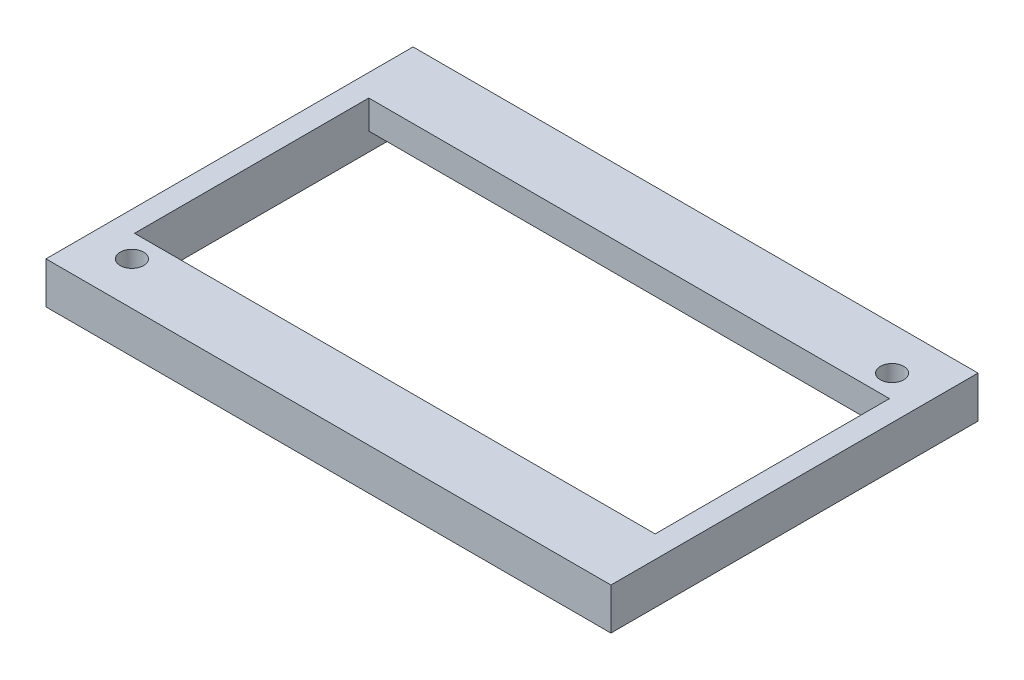
ISO-10303-21;
HEADER;
FILE_DESCRIPTION(('STEP AP214'),'2;1');
FILE_NAME('part.step','',(''),(''),'','','');
FILE_SCHEMA(('AUTOMOTIVE_DESIGN { 1 0 10303 214 1 1 1 1 }'));
ENDSEC;
DATA;
#1=APPLICATION_CONTEXT('core data for automotive mechanical design processes');
#2=APPLICATION_PROTOCOL_DEFINITION('international standard','automotive_design',2000,#1);
#3=PRODUCT_CONTEXT('',#1,'mechanical');
#4=PRODUCT('Part','Part','',(#3));
#5=PRODUCT_RELATED_PRODUCT_CATEGORY('part','',(#4));
#6=PRODUCT_DEFINITION_FORMATION('','',#4);
#7=PRODUCT_DEFINITION_CONTEXT('part definition',#1,'design');
#8=PRODUCT_DEFINITION('design','',#6,#7);
#9=PRODUCT_DEFINITION_SHAPE('','',#8);
#10=(LENGTH_UNIT() NAMED_UNIT(*) SI_UNIT(.MILLI.,.METRE.));
#11=(NAMED_UNIT(*) PLANE_ANGLE_UNIT() SI_UNIT($,.RADIAN.));
#12=(NAMED_UNIT(*) SI_UNIT($,.STERADIAN.) SOLID_ANGLE_UNIT());
#13=UNCERTAINTY_MEASURE_WITH_UNIT(LENGTH_MEASURE(1.E-05),#10,'distance_accuracy_value','');
#14=(GEOMETRIC_REPRESENTATION_CONTEXT(3) GLOBAL_UNCERTAINTY_ASSIGNED_CONTEXT((#13)) GLOBAL_UNIT_ASSIGNED_CONTEXT((#10,
#11,#12)) REPRESENTATION_CONTEXT('',''));
#15=CARTESIAN_POINT('',(0.,0.,0.));
#16=DIRECTION('',(0.,0.,1.));
#17=DIRECTION('',(1.,0.,0.));
#18=AXIS2_PLACEMENT_3D('',#15,#16,#17);
#19=CARTESIAN_POINT('',(50.,-1.,22.5));
#20=DIRECTION('',(0.,0.,-1.));
#21=DIRECTION('',(-1.,0.,0.));
#22=AXIS2_PLACEMENT_3D('',#19,#20,#21);
#23=PLANE('',#22);
#24=DIRECTION('',(0.,1.,0.));
#25=VECTOR('',#24,1.);
#26=CARTESIAN_POINT('',(50.,-1.,22.5));
#27=LINE('',#26,#25);
#28=CARTESIAN_POINT('',(50.,2.5,22.5));
#29=VERTEX_POINT('',#28);
#30=CARTESIAN_POINT('',(50.,8.,22.5));
#31=VERTEX_POINT('',#30);
#32=EDGE_CURVE('E200',#29,#31,#27,.T.);
#33=ORIENTED_EDGE('',*,*,#32,.F.);
#34=DIRECTION('',(-1.,0.,0.));
#35=VECTOR('',#34,1.);
#36=CARTESIAN_POINT('',(50.,2.5,22.5));
#37=LINE('',#36,#35);
#38=CARTESIAN_POINT('',(-50.,2.5,22.5));
#39=VERTEX_POINT('',#38);
#40=EDGE_CURVE('E193',#29,#39,#37,.T.);
#41=ORIENTED_EDGE('',*,*,#40,.T.);
#42=DIRECTION('',(0.,1.,0.));
#43=VECTOR('',#42,1.);
#44=CARTESIAN_POINT('',(-50.,-1.,22.5));
#45=LINE('',#44,#43);
#46=CARTESIAN_POINT('',(-50.,8.,22.5));
#47=VERTEX_POINT('',#46);
#48=EDGE_CURVE('E216',#39,#47,#45,.T.);
#49=ORIENTED_EDGE('',*,*,#48,.T.);
#50=DIRECTION('',(-1.,0.,0.));
#51=VECTOR('',#50,1.);
#52=CARTESIAN_POINT('',(50.,8.,22.5));
#53=LINE('',#52,#51);
#54=EDGE_CURVE('E195',#31,#47,#53,.T.);
#55=ORIENTED_EDGE('',*,*,#54,.F.);
#56=EDGE_LOOP('',(#33,#41,#49,#55));
#57=FACE_BOUND('',#56,.T.);
#58=ADVANCED_FACE('F37',(#57),#23,.T.);
#59=CARTESIAN_POINT('',(50.,-1.,-22.5));
#60=DIRECTION('',(0.,0.,-1.));
#61=DIRECTION('',(-1.,0.,0.));
#62=AXIS2_PLACEMENT_3D('',#59,#60,#61);
#63=PLANE('',#62);
#64=DIRECTION('',(-1.,0.,0.));
#65=VECTOR('',#64,1.);
#66=CARTESIAN_POINT('',(50.,2.5,-22.5));
#67=LINE('',#66,#65);
#68=CARTESIAN_POINT('',(50.,2.5,-22.5));
#69=VERTEX_POINT('',#68);
#70=CARTESIAN_POINT('',(-50.,2.5,-22.5));
#71=VERTEX_POINT('',#70);
#72=EDGE_CURVE('E157',#69,#71,#67,.T.);
#73=ORIENTED_EDGE('',*,*,#72,.F.);
#74=DIRECTION('',(0.,1.,0.));
#75=VECTOR('',#74,1.);
#76=CARTESIAN_POINT('',(50.,-1.,-22.5));
#77=LINE('',#76,#75);
#78=CARTESIAN_POINT('',(50.,8.,-22.5));
#79=VERTEX_POINT('',#78);
#80=EDGE_CURVE('E212',#69,#79,#77,.T.);
#81=ORIENTED_EDGE('',*,*,#80,.T.);
#82=DIRECTION('',(-1.,0.,0.));
#83=VECTOR('',#82,1.);
#84=CARTESIAN_POINT('',(50.,8.,-22.5));
#85=LINE('',#84,#83);
#86=CARTESIAN_POINT('',(-50.,8.,-22.5));
#87=VERTEX_POINT('',#86);
#88=EDGE_CURVE('E206',#79,#87,#85,.T.);
#89=ORIENTED_EDGE('',*,*,#88,.T.);
#90=DIRECTION('',(0.,1.,0.));
#91=VECTOR('',#90,1.);
#92=CARTESIAN_POINT('',(-50.,-1.,-22.5));
#93=LINE('',#92,#91);
#94=EDGE_CURVE('E214',#71,#87,#93,.T.);
#95=ORIENTED_EDGE('',*,*,#94,.F.);
#96=EDGE_LOOP('',(#73,#81,#89,#95));
#97=FACE_BOUND('',#96,.T.);
#98=ADVANCED_FACE('F295',(#97),#63,.F.);
#99=CARTESIAN_POINT('',(0.,8.,0.));
#100=DIRECTION('',(0.,1.,0.));
#101=DIRECTION('',(0.,0.,1.));
#102=AXIS2_PLACEMENT_3D('',#99,#100,#101);
#103=PLANE('',#102);
#104=CARTESIAN_POINT('',(46.,8.,-27.));
#105=DIRECTION('',(0.,1.,0.));
#106=DIRECTION('',(0.,0.,1.));
#107=AXIS2_PLACEMENT_3D('',#104,#105,#106);
#108=CIRCLE('',#107,2.25);
#109=CARTESIAN_POINT('',(46.,8.,-24.75));
#110=VERTEX_POINT('',#109);
#111=EDGE_CURVE('E284',#110,#110,#108,.T.);
#112=ORIENTED_EDGE('',*,*,#111,.F.);
#113=EDGE_LOOP('',(#112));
#114=FACE_BOUND('',#113,.T.);
#115=CARTESIAN_POINT('',(-46.,8.,27.));
#116=DIRECTION('',(0.,1.,0.));
#117=DIRECTION('',(0.,0.,1.));
#118=AXIS2_PLACEMENT_3D('',#115,#116,#117);
#119=CIRCLE('',#118,2.25);
#120=CARTESIAN_POINT('',(-46.,8.,29.25));
#121=VERTEX_POINT('',#120);
#122=EDGE_CURVE('E277',#121,#121,#119,.T.);
#123=ORIENTED_EDGE('',*,*,#122,.F.);
#124=EDGE_LOOP('',(#123));
#125=FACE_BOUND('',#124,.T.);
#126=DIRECTION('',(0.,0.,1.));
#127=VECTOR('',#126,1.);
#128=CARTESIAN_POINT('',(-54.25,8.,35.25));
#129=LINE('',#128,#127);
#130=CARTESIAN_POINT('',(-54.25,8.,-35.25));
#131=VERTEX_POINT('',#130);
#132=CARTESIAN_POINT('',(-54.25,8.,35.25));
#133=VERTEX_POINT('',#132);
#134=EDGE_CURVE('E252',#131,#133,#129,.T.);
#135=ORIENTED_EDGE('',*,*,#134,.T.);
#136=DIRECTION('',(1.,0.,0.));
#137=VECTOR('',#136,1.);
#138=CARTESIAN_POINT('',(54.25,8.,35.25));
#139=LINE('',#138,#137);
#140=CARTESIAN_POINT('',(54.25,8.,35.25));
#141=VERTEX_POINT('',#140);
#142=EDGE_CURVE('E255',#133,#141,#139,.T.);
#143=ORIENTED_EDGE('',*,*,#142,.T.);
#144=DIRECTION('',(0.,0.,-1.));
#145=VECTOR('',#144,1.);
#146=CARTESIAN_POINT('',(54.25,8.,35.25));
#147=LINE('',#146,#145);
#148=CARTESIAN_POINT('',(54.25,8.,-35.25));
#149=VERTEX_POINT('',#148);
#150=EDGE_CURVE('E258',#141,#149,#147,.T.);
#151=ORIENTED_EDGE('',*,*,#150,.T.);
#152=DIRECTION('',(-1.,0.,0.));
#153=VECTOR('',#152,1.);
#154=CARTESIAN_POINT('',(54.25,8.,-35.25));
#155=LINE('',#154,#153);
#156=EDGE_CURVE('E260',#149,#131,#155,.T.);
#157=ORIENTED_EDGE('',*,*,#156,.T.);
#158=EDGE_LOOP('',(#135,#143,#151,#157));
#159=FACE_BOUND('',#158,.T.);
#160=DIRECTION('',(0.,0.,-1.));
#161=VECTOR('',#160,1.);
#162=CARTESIAN_POINT('',(50.,8.,22.5));
#163=LINE('',#162,#161);
#164=EDGE_CURVE('E198',#31,#79,#163,.T.);
#165=ORIENTED_EDGE('',*,*,#164,.F.);
#166=ORIENTED_EDGE('',*,*,#54,.T.);
#167=DIRECTION('',(0.,0.,-1.));
#168=VECTOR('',#167,1.);
#169=CARTESIAN_POINT('',(-50.,8.,22.5));
#170=LINE('',#169,#168);
#171=EDGE_CURVE('E203',#47,#87,#170,.T.);
#172=ORIENTED_EDGE('',*,*,#171,.T.);
#173=ORIENTED_EDGE('',*,*,#88,.F.);
#174=EDGE_LOOP('',(#165,#166,#172,#173));
#175=FACE_BOUND('',#174,.T.);
#176=ADVANCED_FACE('F291',(#114,#125,#159,#175),#103,.T.);
#177=CARTESIAN_POINT('',(0.,-1.,0.));
#178=DIRECTION('',(0.,-1.,0.));
#179=DIRECTION('',(0.,0.,-1.));
#180=AXIS2_PLACEMENT_3D('',#177,#178,#179);
#181=PLANE('',#180);
#182=DIRECTION('',(0.,0.,-1.));
#183=VECTOR('',#182,1.);
#184=CARTESIAN_POINT('',(-50.,-1.,22.5));
#185=LINE('',#184,#183);
#186=CARTESIAN_POINT('',(-50.,-1.,30.25));
#187=VERTEX_POINT('',#186);
#188=CARTESIAN_POINT('',(-50.,-1.,-30.25));
#189=VERTEX_POINT('',#188);
#190=EDGE_CURVE('E166',#187,#189,#185,.T.);
#191=ORIENTED_EDGE('',*,*,#190,.F.);
#192=DIRECTION('',(-1.,0.,0.));
#193=VECTOR('',#192,1.);
#194=CARTESIAN_POINT('',(50.,-1.,30.25));
#195=LINE('',#194,#193);
#196=CARTESIAN_POINT('',(50.,-1.,30.25));
#197=VERTEX_POINT('',#196);
#198=EDGE_CURVE('E160',#197,#187,#195,.T.);
#199=ORIENTED_EDGE('',*,*,#198,.F.);
#200=DIRECTION('',(0.,0.,-1.));
#201=VECTOR('',#200,1.);
#202=CARTESIAN_POINT('',(50.,-1.,22.5));
#203=LINE('',#202,#201);
#204=CARTESIAN_POINT('',(50.,-1.,-30.25));
#205=VERTEX_POINT('',#204);
#206=EDGE_CURVE('E197',#197,#205,#203,.T.);
#207=ORIENTED_EDGE('',*,*,#206,.T.);
#208=DIRECTION('',(1.,0.,0.));
#209=VECTOR('',#208,1.);
#210=CARTESIAN_POINT('',(50.,-1.,-30.25));
#211=LINE('',#210,#209);
#212=EDGE_CURVE('E181',#189,#205,#211,.T.);
#213=ORIENTED_EDGE('',*,*,#212,.F.);
#214=EDGE_LOOP('',(#191,#199,#207,#213));
#215=FACE_BOUND('',#214,.T.);
#216=DIRECTION('',(0.,0.,-1.));
#217=VECTOR('',#216,1.);
#218=CARTESIAN_POINT('',(-51.25,-1.,-32.25));
#219=LINE('',#218,#217);
#220=CARTESIAN_POINT('',(-51.25,-1.,32.25));
#221=VERTEX_POINT('',#220);
#222=CARTESIAN_POINT('',(-51.25,-1.,-32.25));
#223=VERTEX_POINT('',#222);
#224=EDGE_CURVE('E219',#221,#223,#219,.T.);
#225=ORIENTED_EDGE('',*,*,#224,.T.);
#226=DIRECTION('',(1.,0.,0.));
#227=VECTOR('',#226,1.);
#228=CARTESIAN_POINT('',(51.25,-1.,-32.25));
#229=LINE('',#228,#227);
#230=CARTESIAN_POINT('',(51.25,-1.,-32.25));
#231=VERTEX_POINT('',#230);
#232=EDGE_CURVE('E222',#223,#231,#229,.T.);
#233=ORIENTED_EDGE('',*,*,#232,.T.);
#234=DIRECTION('',(0.,0.,1.));
#235=VECTOR('',#234,1.);
#236=CARTESIAN_POINT('',(51.25,-1.,-32.25));
#237=LINE('',#236,#235);
#238=CARTESIAN_POINT('',(51.25,-1.,32.25));
#239=VERTEX_POINT('',#238);
#240=EDGE_CURVE('E225',#231,#239,#237,.T.);
#241=ORIENTED_EDGE('',*,*,#240,.T.);
#242=DIRECTION('',(-1.,0.,0.));
#243=VECTOR('',#242,1.);
#244=CARTESIAN_POINT('',(51.25,-1.,32.25));
#245=LINE('',#244,#243);
#246=EDGE_CURVE('E227',#239,#221,#245,.T.);
#247=ORIENTED_EDGE('',*,*,#246,.T.);
#248=EDGE_LOOP('',(#225,#233,#241,#247));
#249=FACE_BOUND('',#248,.T.);
#250=ADVANCED_FACE('F294',(#215,#249),#181,.T.);
#251=CARTESIAN_POINT('',(0.,0.,0.));
#252=DIRECTION('',(0.,1.,0.));
#253=DIRECTION('',(0.,0.,1.));
#254=AXIS2_PLACEMENT_3D('',#251,#252,#253);
#255=PLANE('',#254);
#256=DIRECTION('',(0.,0.,1.));
#257=VECTOR('',#256,1.);
#258=CARTESIAN_POINT('',(-54.25,0.,35.25));
#259=LINE('',#258,#257);
#260=CARTESIAN_POINT('',(-54.25,0.,-35.25));
#261=VERTEX_POINT('',#260);
#262=CARTESIAN_POINT('',(-54.25,0.,35.25));
#263=VERTEX_POINT('',#262);
#264=EDGE_CURVE('E251',#261,#263,#259,.T.);
#265=ORIENTED_EDGE('',*,*,#264,.F.);
#266=DIRECTION('',(-1.,0.,0.));
#267=VECTOR('',#266,1.);
#268=CARTESIAN_POINT('',(54.25,0.,-35.25));
#269=LINE('',#268,#267);
#270=CARTESIAN_POINT('',(54.25,0.,-35.25));
#271=VERTEX_POINT('',#270);
#272=EDGE_CURVE('E256',#271,#261,#269,.T.);
#273=ORIENTED_EDGE('',*,*,#272,.F.);
#274=DIRECTION('',(0.,0.,-1.));
#275=VECTOR('',#274,1.);
#276=CARTESIAN_POINT('',(54.25,0.,35.25));
#277=LINE('',#276,#275);
#278=CARTESIAN_POINT('',(54.25,0.,35.25));
#279=VERTEX_POINT('',#278);
#280=EDGE_CURVE('E267',#279,#271,#277,.T.);
#281=ORIENTED_EDGE('',*,*,#280,.F.);
#282=DIRECTION('',(1.,0.,0.));
#283=VECTOR('',#282,1.);
#284=CARTESIAN_POINT('',(54.25,0.,35.25));
#285=LINE('',#284,#283);
#286=EDGE_CURVE('E265',#263,#279,#285,.T.);
#287=ORIENTED_EDGE('',*,*,#286,.F.);
#288=EDGE_LOOP('',(#265,#273,#281,#287));
#289=FACE_BOUND('',#288,.T.);
#290=DIRECTION('',(0.,0.,-1.));
#291=VECTOR('',#290,1.);
#292=CARTESIAN_POINT('',(-51.25,0.,-32.25));
#293=LINE('',#292,#291);
#294=CARTESIAN_POINT('',(-51.25,0.,32.25));
#295=VERTEX_POINT('',#294);
#296=CARTESIAN_POINT('',(-51.25,0.,-32.25));
#297=VERTEX_POINT('',#296);
#298=EDGE_CURVE('E218',#295,#297,#293,.T.);
#299=ORIENTED_EDGE('',*,*,#298,.F.);
#300=DIRECTION('',(-1.,0.,0.));
#301=VECTOR('',#300,1.);
#302=CARTESIAN_POINT('',(51.25,0.,32.25));
#303=LINE('',#302,#301);
#304=CARTESIAN_POINT('',(51.25,0.,32.25));
#305=VERTEX_POINT('',#304);
#306=EDGE_CURVE('E223',#305,#295,#303,.T.);
#307=ORIENTED_EDGE('',*,*,#306,.F.);
#308=DIRECTION('',(0.,0.,1.));
#309=VECTOR('',#308,1.);
#310=CARTESIAN_POINT('',(51.25,0.,-32.25));
#311=LINE('',#310,#309);
#312=CARTESIAN_POINT('',(51.25,0.,-32.25));
#313=VERTEX_POINT('',#312);
#314=EDGE_CURVE('E235',#313,#305,#311,.T.);
#315=ORIENTED_EDGE('',*,*,#314,.F.);
#316=DIRECTION('',(1.,0.,0.));
#317=VECTOR('',#316,1.);
#318=CARTESIAN_POINT('',(51.25,0.,-32.25));
#319=LINE('',#318,#317);
#320=EDGE_CURVE('E232',#297,#313,#319,.T.);
#321=ORIENTED_EDGE('',*,*,#320,.F.);
#322=EDGE_LOOP('',(#299,#307,#315,#321));
#323=FACE_BOUND('',#322,.T.);
#324=ADVANCED_FACE('F328',(#289,#323),#255,.F.);
#325=CARTESIAN_POINT('',(-54.25,8.,35.25));
#326=DIRECTION('',(1.,0.,0.));
#327=DIRECTION('',(0.,0.,-1.));
#328=AXIS2_PLACEMENT_3D('',#325,#326,#327);
#329=PLANE('',#328);
#330=ORIENTED_EDGE('',*,*,#264,.T.);
#331=DIRECTION('',(0.,-1.,0.));
#332=VECTOR('',#331,1.);
#333=CARTESIAN_POINT('',(-54.25,8.,35.25));
#334=LINE('',#333,#332);
#335=EDGE_CURVE('E11',#133,#263,#334,.T.);
#336=ORIENTED_EDGE('',*,*,#335,.F.);
#337=ORIENTED_EDGE('',*,*,#134,.F.);
#338=DIRECTION('',(0.,-1.,0.));
#339=VECTOR('',#338,1.);
#340=CARTESIAN_POINT('',(-54.25,8.,-35.25));
#341=LINE('',#340,#339);
#342=EDGE_CURVE('E262',#131,#261,#341,.T.);
#343=ORIENTED_EDGE('',*,*,#342,.T.);
#344=EDGE_LOOP('',(#330,#336,#337,#343));
#345=FACE_BOUND('',#344,.T.);
#346=ADVANCED_FACE('F39',(#345),#329,.F.);
#347=CARTESIAN_POINT('',(54.25,8.,35.25));
#348=DIRECTION('',(0.,0.,-1.));
#349=DIRECTION('',(-1.,0.,0.));
#350=AXIS2_PLACEMENT_3D('',#347,#348,#349);
#351=PLANE('',#350);
#352=ORIENTED_EDGE('',*,*,#286,.T.);
#353=DIRECTION('',(0.,-1.,0.));
#354=VECTOR('',#353,1.);
#355=CARTESIAN_POINT('',(54.25,8.,35.25));
#356=LINE('',#355,#354);
#357=EDGE_CURVE('E46',#141,#279,#356,.T.);
#358=ORIENTED_EDGE('',*,*,#357,.F.);
#359=ORIENTED_EDGE('',*,*,#142,.F.);
#360=ORIENTED_EDGE('',*,*,#335,.T.);
#361=EDGE_LOOP('',(#352,#358,#359,#360));
#362=FACE_BOUND('',#361,.T.);
#363=ADVANCED_FACE('F354',(#362),#351,.F.);
#364=CARTESIAN_POINT('',(54.25,8.,35.25));
#365=DIRECTION('',(-1.,0.,0.));
#366=DIRECTION('',(0.,0.,1.));
#367=AXIS2_PLACEMENT_3D('',#364,#365,#366);
#368=PLANE('',#367);
#369=ORIENTED_EDGE('',*,*,#280,.T.);
#370=DIRECTION('',(0.,-1.,0.));
#371=VECTOR('',#370,1.);
#372=CARTESIAN_POINT('',(54.25,8.,-35.25));
#373=LINE('',#372,#371);
#374=EDGE_CURVE('E272',#149,#271,#373,.T.);
#375=ORIENTED_EDGE('',*,*,#374,.F.);
#376=ORIENTED_EDGE('',*,*,#150,.F.);
#377=ORIENTED_EDGE('',*,*,#357,.T.);
#378=EDGE_LOOP('',(#369,#375,#376,#377));
#379=FACE_BOUND('',#378,.T.);
#380=ADVANCED_FACE('F351',(#379),#368,.F.);
#381=CARTESIAN_POINT('',(54.25,8.,-35.25));
#382=DIRECTION('',(0.,0.,1.));
#383=DIRECTION('',(1.,0.,0.));
#384=AXIS2_PLACEMENT_3D('',#381,#382,#383);
#385=PLANE('',#384);
#386=ORIENTED_EDGE('',*,*,#272,.T.);
#387=ORIENTED_EDGE('',*,*,#342,.F.);
#388=ORIENTED_EDGE('',*,*,#156,.F.);
#389=ORIENTED_EDGE('',*,*,#374,.T.);
#390=EDGE_LOOP('',(#386,#387,#388,#389));
#391=FACE_BOUND('',#390,.T.);
#392=ADVANCED_FACE('F343',(#391),#385,.F.);
#393=CARTESIAN_POINT('',(-51.25,-1.,-32.25));
#394=DIRECTION('',(1.,0.,0.));
#395=DIRECTION('',(0.,0.,-1.));
#396=AXIS2_PLACEMENT_3D('',#393,#394,#395);
#397=PLANE('',#396);
#398=ORIENTED_EDGE('',*,*,#298,.T.);
#399=DIRECTION('',(0.,1.,0.));
#400=VECTOR('',#399,1.);
#401=CARTESIAN_POINT('',(-51.25,-1.,-32.25));
#402=LINE('',#401,#400);
#403=EDGE_CURVE('E248',#223,#297,#402,.T.);
#404=ORIENTED_EDGE('',*,*,#403,.F.);
#405=ORIENTED_EDGE('',*,*,#224,.F.);
#406=DIRECTION('',(0.,1.,0.));
#407=VECTOR('',#406,1.);
#408=CARTESIAN_POINT('',(-51.25,-1.,32.25));
#409=LINE('',#408,#407);
#410=EDGE_CURVE('E229',#221,#295,#409,.T.);
#411=ORIENTED_EDGE('',*,*,#410,.T.);
#412=EDGE_LOOP('',(#398,#404,#405,#411));
#413=FACE_BOUND('',#412,.T.);
#414=ADVANCED_FACE('F340',(#413),#397,.F.);
#415=CARTESIAN_POINT('',(51.25,-1.,-32.25));
#416=DIRECTION('',(0.,0.,1.));
#417=DIRECTION('',(1.,0.,0.));
#418=AXIS2_PLACEMENT_3D('',#415,#416,#417);
#419=PLANE('',#418);
#420=ORIENTED_EDGE('',*,*,#320,.T.);
#421=DIRECTION('',(0.,1.,0.));
#422=VECTOR('',#421,1.);
#423=CARTESIAN_POINT('',(51.25,-1.,-32.25));
#424=LINE('',#423,#422);
#425=EDGE_CURVE('E245',#231,#313,#424,.T.);
#426=ORIENTED_EDGE('',*,*,#425,.F.);
#427=ORIENTED_EDGE('',*,*,#232,.F.);
#428=ORIENTED_EDGE('',*,*,#403,.T.);
#429=EDGE_LOOP('',(#420,#426,#427,#428));
#430=FACE_BOUND('',#429,.T.);
#431=ADVANCED_FACE('F336',(#430),#419,.F.);
#432=CARTESIAN_POINT('',(51.25,-1.,-32.25));
#433=DIRECTION('',(-1.,0.,0.));
#434=DIRECTION('',(0.,0.,1.));
#435=AXIS2_PLACEMENT_3D('',#432,#433,#434);
#436=PLANE('',#435);
#437=ORIENTED_EDGE('',*,*,#314,.T.);
#438=DIRECTION('',(0.,1.,0.));
#439=VECTOR('',#438,1.);
#440=CARTESIAN_POINT('',(51.25,-1.,32.25));
#441=LINE('',#440,#439);
#442=EDGE_CURVE('E242',#239,#305,#441,.T.);
#443=ORIENTED_EDGE('',*,*,#442,.F.);
#444=ORIENTED_EDGE('',*,*,#240,.F.);
#445=ORIENTED_EDGE('',*,*,#425,.T.);
#446=EDGE_LOOP('',(#437,#443,#444,#445));
#447=FACE_BOUND('',#446,.T.);
#448=ADVANCED_FACE('F332',(#447),#436,.F.);
#449=CARTESIAN_POINT('',(51.25,-1.,32.25));
#450=DIRECTION('',(0.,0.,-1.));
#451=DIRECTION('',(-1.,0.,0.));
#452=AXIS2_PLACEMENT_3D('',#449,#450,#451);
#453=PLANE('',#452);
#454=ORIENTED_EDGE('',*,*,#306,.T.);
#455=ORIENTED_EDGE('',*,*,#410,.F.);
#456=ORIENTED_EDGE('',*,*,#246,.F.);
#457=ORIENTED_EDGE('',*,*,#442,.T.);
#458=EDGE_LOOP('',(#454,#455,#456,#457));
#459=FACE_BOUND('',#458,.T.);
#460=ADVANCED_FACE('F324',(#459),#453,.F.);
#461=CARTESIAN_POINT('',(-50.,-1.,22.5));
#462=DIRECTION('',(1.,0.,0.));
#463=DIRECTION('',(0.,0.,-1.));
#464=AXIS2_PLACEMENT_3D('',#461,#462,#463);
#465=PLANE('',#464);
#466=DIRECTION('',(0.,0.,-1.));
#467=VECTOR('',#466,1.);
#468=CARTESIAN_POINT('',(-50.,2.5,-30.25));
#469=LINE('',#468,#467);
#470=CARTESIAN_POINT('',(-50.,2.5,-30.25));
#471=VERTEX_POINT('',#470);
#472=EDGE_CURVE('E152',#71,#471,#469,.T.);
#473=ORIENTED_EDGE('',*,*,#472,.F.);
#474=ORIENTED_EDGE('',*,*,#94,.T.);
#475=ORIENTED_EDGE('',*,*,#171,.F.);
#476=ORIENTED_EDGE('',*,*,#48,.F.);
#477=CARTESIAN_POINT('',(-50.,2.5,30.25));
#478=VERTEX_POINT('',#477);
#479=EDGE_CURVE('E54',#478,#39,#469,.T.);
#480=ORIENTED_EDGE('',*,*,#479,.F.);
#481=DIRECTION('',(0.,-1.,0.));
#482=VECTOR('',#481,1.);
#483=CARTESIAN_POINT('',(-50.,2.5,30.25));
#484=LINE('',#483,#482);
#485=EDGE_CURVE('E186',#478,#187,#484,.T.);
#486=ORIENTED_EDGE('',*,*,#485,.T.);
#487=ORIENTED_EDGE('',*,*,#190,.T.);
#488=DIRECTION('',(0.,-1.,0.));
#489=VECTOR('',#488,1.);
#490=CARTESIAN_POINT('',(-50.,2.5,-30.25));
#491=LINE('',#490,#489);
#492=EDGE_CURVE('E163',#471,#189,#491,.T.);
#493=ORIENTED_EDGE('',*,*,#492,.F.);
#494=EDGE_LOOP('',(#473,#474,#475,#476,#480,#486,#487,#493));
#495=FACE_BOUND('',#494,.T.);
#496=ADVANCED_FACE('F164',(#495),#465,.T.);
#497=CARTESIAN_POINT('',(50.,-1.,22.5));
#498=DIRECTION('',(1.,0.,0.));
#499=DIRECTION('',(0.,0.,-1.));
#500=AXIS2_PLACEMENT_3D('',#497,#498,#499);
#501=PLANE('',#500);
#502=ORIENTED_EDGE('',*,*,#206,.F.);
#503=DIRECTION('',(0.,-1.,0.));
#504=VECTOR('',#503,1.);
#505=CARTESIAN_POINT('',(50.,2.5,30.25));
#506=LINE('',#505,#504);
#507=CARTESIAN_POINT('',(50.,2.5,30.25));
#508=VERTEX_POINT('',#507);
#509=EDGE_CURVE('E188',#508,#197,#506,.T.);
#510=ORIENTED_EDGE('',*,*,#509,.F.);
#511=DIRECTION('',(0.,0.,1.));
#512=VECTOR('',#511,1.);
#513=CARTESIAN_POINT('',(50.,2.5,-30.25));
#514=LINE('',#513,#512);
#515=EDGE_CURVE('E175',#29,#508,#514,.T.);
#516=ORIENTED_EDGE('',*,*,#515,.F.);
#517=ORIENTED_EDGE('',*,*,#32,.T.);
#518=ORIENTED_EDGE('',*,*,#164,.T.);
#519=ORIENTED_EDGE('',*,*,#80,.F.);
#520=CARTESIAN_POINT('',(50.,2.5,-30.25));
#521=VERTEX_POINT('',#520);
#522=EDGE_CURVE('E62',#521,#69,#514,.T.);
#523=ORIENTED_EDGE('',*,*,#522,.F.);
#524=DIRECTION('',(0.,-1.,0.));
#525=VECTOR('',#524,1.);
#526=CARTESIAN_POINT('',(50.,2.5,-30.25));
#527=LINE('',#526,#525);
#528=EDGE_CURVE('E170',#521,#205,#527,.T.);
#529=ORIENTED_EDGE('',*,*,#528,.T.);
#530=EDGE_LOOP('',(#502,#510,#516,#517,#518,#519,#523,#529));
#531=FACE_BOUND('',#530,.T.);
#532=ADVANCED_FACE('F306',(#531),#501,.F.);
#533=CARTESIAN_POINT('',(0.,2.5,0.));
#534=DIRECTION('',(0.,-1.,0.));
#535=DIRECTION('',(0.,0.,-1.));
#536=AXIS2_PLACEMENT_3D('',#533,#534,#535);
#537=PLANE('',#536);
#538=CARTESIAN_POINT('',(46.,2.5,-27.));
#539=DIRECTION('',(0.,-1.,0.));
#540=DIRECTION('',(0.,0.,-1.));
#541=AXIS2_PLACEMENT_3D('',#538,#539,#540);
#542=CIRCLE('',#541,2.25);
#543=CARTESIAN_POINT('',(46.,2.5,-29.25));
#544=VERTEX_POINT('',#543);
#545=EDGE_CURVE('E41',#544,#544,#542,.T.);
#546=ORIENTED_EDGE('',*,*,#545,.F.);
#547=EDGE_LOOP('',(#546));
#548=FACE_BOUND('',#547,.T.);
#549=ORIENTED_EDGE('',*,*,#72,.T.);
#550=ORIENTED_EDGE('',*,*,#472,.T.);
#551=DIRECTION('',(1.,0.,0.));
#552=VECTOR('',#551,1.);
#553=CARTESIAN_POINT('',(50.,2.5,-30.25));
#554=LINE('',#553,#552);
#555=EDGE_CURVE('E156',#471,#521,#554,.T.);
#556=ORIENTED_EDGE('',*,*,#555,.T.);
#557=ORIENTED_EDGE('',*,*,#522,.T.);
#558=EDGE_LOOP('',(#549,#550,#556,#557));
#559=FACE_BOUND('',#558,.T.);
#560=ADVANCED_FACE('F154',(#548,#559),#537,.T.);
#561=CARTESIAN_POINT('',(50.,2.5,-30.25));
#562=DIRECTION('',(0.,0.,-1.));
#563=DIRECTION('',(-1.,0.,0.));
#564=AXIS2_PLACEMENT_3D('',#561,#562,#563);
#565=PLANE('',#564);
#566=ORIENTED_EDGE('',*,*,#212,.T.);
#567=ORIENTED_EDGE('',*,*,#528,.F.);
#568=ORIENTED_EDGE('',*,*,#555,.F.);
#569=ORIENTED_EDGE('',*,*,#492,.T.);
#570=EDGE_LOOP('',(#566,#567,#568,#569));
#571=FACE_BOUND('',#570,.T.);
#572=ADVANCED_FACE('F173',(#571),#565,.F.);
#573=CARTESIAN_POINT('',(50.,2.5,30.25));
#574=DIRECTION('',(0.,0.,1.));
#575=DIRECTION('',(1.,0.,0.));
#576=AXIS2_PLACEMENT_3D('',#573,#574,#575);
#577=PLANE('',#576);
#578=ORIENTED_EDGE('',*,*,#198,.T.);
#579=ORIENTED_EDGE('',*,*,#485,.F.);
#580=DIRECTION('',(-1.,0.,0.));
#581=VECTOR('',#580,1.);
#582=CARTESIAN_POINT('',(50.,2.5,30.25));
#583=LINE('',#582,#581);
#584=EDGE_CURVE('E171',#508,#478,#583,.T.);
#585=ORIENTED_EDGE('',*,*,#584,.F.);
#586=ORIENTED_EDGE('',*,*,#509,.T.);
#587=EDGE_LOOP('',(#578,#579,#585,#586));
#588=FACE_BOUND('',#587,.T.);
#589=ADVANCED_FACE('F403',(#588),#577,.F.);
#590=CARTESIAN_POINT('',(-46.,2.5,27.));
#591=DIRECTION('',(0.,-1.,0.));
#592=DIRECTION('',(0.,0.,-1.));
#593=AXIS2_PLACEMENT_3D('',#590,#591,#592);
#594=CIRCLE('',#593,2.25);
#595=CARTESIAN_POINT('',(-46.,2.5,24.75));
#596=VERTEX_POINT('',#595);
#597=EDGE_CURVE('E183',#596,#596,#594,.T.);
#598=ORIENTED_EDGE('',*,*,#597,.F.);
#599=EDGE_LOOP('',(#598));
#600=FACE_BOUND('',#599,.T.);
#601=ORIENTED_EDGE('',*,*,#515,.T.);
#602=ORIENTED_EDGE('',*,*,#584,.T.);
#603=ORIENTED_EDGE('',*,*,#479,.T.);
#604=ORIENTED_EDGE('',*,*,#40,.F.);
#605=EDGE_LOOP('',(#601,#602,#603,#604));
#606=FACE_BOUND('',#605,.T.);
#607=ADVANCED_FACE('F414',(#600,#606),#537,.T.);
#608=CARTESIAN_POINT('',(-46.,-1.,27.));
#609=DIRECTION('',(0.,1.,0.));
#610=DIRECTION('',(0.,0.,1.));
#611=AXIS2_PLACEMENT_3D('',#608,#609,#610);
#612=CYLINDRICAL_SURFACE('',#611,2.25);
#613=ORIENTED_EDGE('',*,*,#597,.T.);
#614=EDGE_LOOP('',(#613));
#615=FACE_BOUND('',#614,.T.);
#616=ORIENTED_EDGE('',*,*,#122,.T.);
#617=EDGE_LOOP('',(#616));
#618=FACE_BOUND('',#617,.T.);
#619=ADVANCED_FACE('F426',(#615,#618),#612,.F.);
#620=CARTESIAN_POINT('',(46.,-1.,-27.));
#621=DIRECTION('',(0.,1.,0.));
#622=DIRECTION('',(0.,0.,1.));
#623=AXIS2_PLACEMENT_3D('',#620,#621,#622);
#624=CYLINDRICAL_SURFACE('',#623,2.25);
#625=ORIENTED_EDGE('',*,*,#545,.T.);
#626=EDGE_LOOP('',(#625));
#627=FACE_BOUND('',#626,.T.);
#628=ORIENTED_EDGE('',*,*,#111,.T.);
#629=EDGE_LOOP('',(#628));
#630=FACE_BOUND('',#629,.T.);
#631=ADVANCED_FACE('F289',(#627,#630),#624,.F.);
#632=CLOSED_SHELL('',(#58,#98,#176,#250,#324,#346,#363,#380,#392,#414,#431,#448,#460,#496,#532,
#560,#572,#589,#607,#619,#631));
#633=MANIFOLD_SOLID_BREP('B2',#632);
#634=ADVANCED_BREP_SHAPE_REPRESENTATION('',(#18,#633),#14);
#635=SHAPE_DEFINITION_REPRESENTATION(#9,#634);
ENDSEC;
END-ISO-10303-21;
